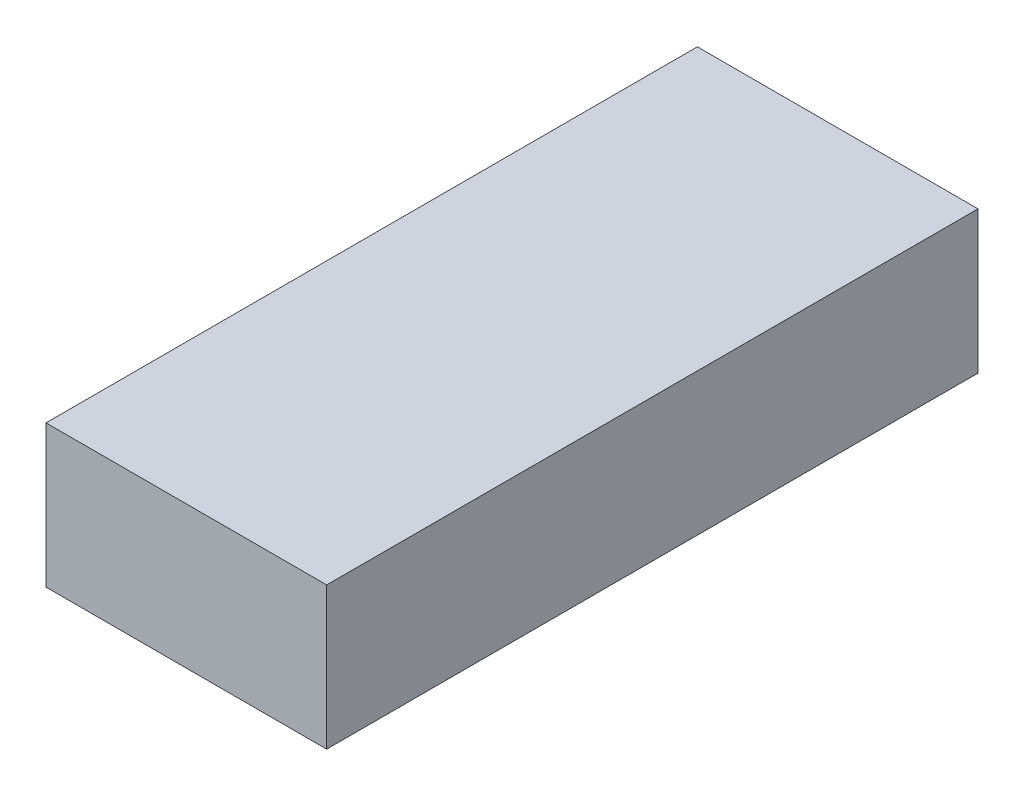
ISO-10303-21;
HEADER;
FILE_DESCRIPTION(('STEP AP214'),'2;1');
FILE_NAME('part.step','',(''),(''),'','','');
FILE_SCHEMA(('AUTOMOTIVE_DESIGN { 1 0 10303 214 1 1 1 1 }'));
ENDSEC;
DATA;
#1=APPLICATION_CONTEXT('core data for automotive mechanical design processes');
#2=APPLICATION_PROTOCOL_DEFINITION('international standard','automotive_design',2000,#1);
#3=PRODUCT_CONTEXT('',#1,'mechanical');
#4=PRODUCT('Part','Part','',(#3));
#5=PRODUCT_RELATED_PRODUCT_CATEGORY('part','',(#4));
#6=PRODUCT_DEFINITION_FORMATION('','',#4);
#7=PRODUCT_DEFINITION_CONTEXT('part definition',#1,'design');
#8=PRODUCT_DEFINITION('design','',#6,#7);
#9=PRODUCT_DEFINITION_SHAPE('','',#8);
#10=(LENGTH_UNIT() NAMED_UNIT(*) SI_UNIT(.MILLI.,.METRE.));
#11=(NAMED_UNIT(*) PLANE_ANGLE_UNIT() SI_UNIT($,.RADIAN.));
#12=(NAMED_UNIT(*) SI_UNIT($,.STERADIAN.) SOLID_ANGLE_UNIT());
#13=UNCERTAINTY_MEASURE_WITH_UNIT(LENGTH_MEASURE(1.E-05),#10,'distance_accuracy_value','');
#14=(GEOMETRIC_REPRESENTATION_CONTEXT(3) GLOBAL_UNCERTAINTY_ASSIGNED_CONTEXT((#13)) GLOBAL_UNIT_ASSIGNED_CONTEXT((#10,
#11,#12)) REPRESENTATION_CONTEXT('',''));
#15=CARTESIAN_POINT('',(0.,0.,0.));
#16=DIRECTION('',(0.,0.,1.));
#17=DIRECTION('',(1.,0.,0.));
#18=AXIS2_PLACEMENT_3D('',#15,#16,#17);
#19=CARTESIAN_POINT('',(-61.4499399668848,31.1676928938666,300.));
#20=DIRECTION('',(1.,0.,0.));
#21=DIRECTION('',(0.,0.,-1.));
#22=AXIS2_PLACEMENT_3D('',#19,#20,#21);
#23=PLANE('',#22);
#24=DIRECTION('',(0.,-1.,0.));
#25=VECTOR('',#24,1.);
#26=CARTESIAN_POINT('',(-61.4499399668848,31.1676928938666,0.));
#27=LINE('',#26,#25);
#28=CARTESIAN_POINT('',(-61.4499399668848,31.1676928938666,0.));
#29=VERTEX_POINT('',#28);
#30=CARTESIAN_POINT('',(-61.4499399668848,-34.3552978489212,0.));
#31=VERTEX_POINT('',#30);
#32=EDGE_CURVE('E100',#29,#31,#27,.T.);
#33=ORIENTED_EDGE('',*,*,#32,.T.);
#34=DIRECTION('',(0.,0.,-1.));
#35=VECTOR('',#34,1.);
#36=CARTESIAN_POINT('',(-61.4499399668848,-34.3552978489212,300.));
#37=LINE('',#36,#35);
#38=CARTESIAN_POINT('',(-61.4499399668848,-34.3552978489212,300.));
#39=VERTEX_POINT('',#38);
#40=EDGE_CURVE('E11',#39,#31,#37,.T.);
#41=ORIENTED_EDGE('',*,*,#40,.F.);
#42=DIRECTION('',(0.,-1.,0.));
#43=VECTOR('',#42,1.);
#44=CARTESIAN_POINT('',(-61.4499399668848,31.1676928938666,300.));
#45=LINE('',#44,#43);
#46=CARTESIAN_POINT('',(-61.4499399668848,31.1676928938666,300.));
#47=VERTEX_POINT('',#46);
#48=EDGE_CURVE('E88',#47,#39,#45,.T.);
#49=ORIENTED_EDGE('',*,*,#48,.F.);
#50=DIRECTION('',(0.,0.,-1.));
#51=VECTOR('',#50,1.);
#52=CARTESIAN_POINT('',(-61.4499399668848,31.1676928938666,300.));
#53=LINE('',#52,#51);
#54=EDGE_CURVE('E96',#47,#29,#53,.T.);
#55=ORIENTED_EDGE('',*,*,#54,.T.);
#56=EDGE_LOOP('',(#33,#41,#49,#55));
#57=FACE_BOUND('',#56,.T.);
#58=ADVANCED_FACE('F37',(#57),#23,.F.);
#59=CARTESIAN_POINT('',(-61.4499399668848,-34.3552978489212,300.));
#60=DIRECTION('',(0.,1.,0.));
#61=DIRECTION('',(0.,0.,1.));
#62=AXIS2_PLACEMENT_3D('',#59,#60,#61);
#63=PLANE('',#62);
#64=DIRECTION('',(1.,0.,0.));
#65=VECTOR('',#64,1.);
#66=CARTESIAN_POINT('',(-61.4499399668848,-34.3552978489212,0.));
#67=LINE('',#66,#65);
#68=CARTESIAN_POINT('',(67.8251498769938,-34.3552978489212,0.));
#69=VERTEX_POINT('',#68);
#70=EDGE_CURVE('E92',#31,#69,#67,.T.);
#71=ORIENTED_EDGE('',*,*,#70,.T.);
#72=DIRECTION('',(0.,0.,-1.));
#73=VECTOR('',#72,1.);
#74=CARTESIAN_POINT('',(67.8251498769938,-34.3552978489212,300.));
#75=LINE('',#74,#73);
#76=CARTESIAN_POINT('',(67.8251498769938,-34.3552978489212,300.));
#77=VERTEX_POINT('',#76);
#78=EDGE_CURVE('E45',#77,#69,#75,.T.);
#79=ORIENTED_EDGE('',*,*,#78,.F.);
#80=DIRECTION('',(1.,0.,0.));
#81=VECTOR('',#80,1.);
#82=CARTESIAN_POINT('',(-61.4499399668848,-34.3552978489212,300.));
#83=LINE('',#82,#81);
#84=EDGE_CURVE('E83',#39,#77,#83,.T.);
#85=ORIENTED_EDGE('',*,*,#84,.F.);
#86=ORIENTED_EDGE('',*,*,#40,.T.);
#87=EDGE_LOOP('',(#71,#79,#85,#86));
#88=FACE_BOUND('',#87,.T.);
#89=ADVANCED_FACE('F91',(#88),#63,.F.);
#90=CARTESIAN_POINT('',(67.8251498769938,31.1676928938666,300.));
#91=DIRECTION('',(-1.,0.,0.));
#92=DIRECTION('',(0.,0.,1.));
#93=AXIS2_PLACEMENT_3D('',#90,#91,#92);
#94=PLANE('',#93);
#95=DIRECTION('',(0.,1.,0.));
#96=VECTOR('',#95,1.);
#97=CARTESIAN_POINT('',(67.8251498769938,31.1676928938666,0.));
#98=LINE('',#97,#96);
#99=CARTESIAN_POINT('',(67.8251498769938,31.1676928938666,0.));
#100=VERTEX_POINT('',#99);
#101=EDGE_CURVE('E70',#69,#100,#98,.T.);
#102=ORIENTED_EDGE('',*,*,#101,.T.);
#103=DIRECTION('',(0.,0.,-1.));
#104=VECTOR('',#103,1.);
#105=CARTESIAN_POINT('',(67.8251498769938,31.1676928938666,300.));
#106=LINE('',#105,#104);
#107=CARTESIAN_POINT('',(67.8251498769938,31.1676928938666,300.));
#108=VERTEX_POINT('',#107);
#109=EDGE_CURVE('E93',#108,#100,#106,.T.);
#110=ORIENTED_EDGE('',*,*,#109,.F.);
#111=DIRECTION('',(0.,1.,0.));
#112=VECTOR('',#111,1.);
#113=CARTESIAN_POINT('',(67.8251498769938,31.1676928938666,300.));
#114=LINE('',#113,#112);
#115=EDGE_CURVE('E86',#77,#108,#114,.T.);
#116=ORIENTED_EDGE('',*,*,#115,.F.);
#117=ORIENTED_EDGE('',*,*,#78,.T.);
#118=EDGE_LOOP('',(#102,#110,#116,#117));
#119=FACE_BOUND('',#118,.T.);
#120=ADVANCED_FACE('F94',(#119),#94,.F.);
#121=CARTESIAN_POINT('',(-61.4499399668848,31.1676928938666,300.));
#122=DIRECTION('',(0.,-1.,0.));
#123=DIRECTION('',(0.,0.,-1.));
#124=AXIS2_PLACEMENT_3D('',#121,#122,#123);
#125=PLANE('',#124);
#126=DIRECTION('',(-1.,0.,0.));
#127=VECTOR('',#126,1.);
#128=CARTESIAN_POINT('',(-61.4499399668848,31.1676928938666,0.));
#129=LINE('',#128,#127);
#130=EDGE_CURVE('E76',#100,#29,#129,.T.);
#131=ORIENTED_EDGE('',*,*,#130,.T.);
#132=ORIENTED_EDGE('',*,*,#54,.F.);
#133=DIRECTION('',(-1.,0.,0.));
#134=VECTOR('',#133,1.);
#135=CARTESIAN_POINT('',(-61.4499399668848,31.1676928938666,300.));
#136=LINE('',#135,#134);
#137=EDGE_CURVE('E53',#108,#47,#136,.T.);
#138=ORIENTED_EDGE('',*,*,#137,.F.);
#139=ORIENTED_EDGE('',*,*,#109,.T.);
#140=EDGE_LOOP('',(#131,#132,#138,#139));
#141=FACE_BOUND('',#140,.T.);
#142=ADVANCED_FACE('F107',(#141),#125,.F.);
#143=CARTESIAN_POINT('',(0.,0.,300.));
#144=DIRECTION('',(0.,0.,1.));
#145=DIRECTION('',(1.,0.,0.));
#146=AXIS2_PLACEMENT_3D('',#143,#144,#145);
#147=PLANE('',#146);
#148=ORIENTED_EDGE('',*,*,#48,.T.);
#149=ORIENTED_EDGE('',*,*,#84,.T.);
#150=ORIENTED_EDGE('',*,*,#115,.T.);
#151=ORIENTED_EDGE('',*,*,#137,.T.);
#152=EDGE_LOOP('',(#148,#149,#150,#151));
#153=FACE_BOUND('',#152,.T.);
#154=ADVANCED_FACE('F84',(#153),#147,.T.);
#155=CARTESIAN_POINT('',(0.,0.,0.));
#156=DIRECTION('',(0.,0.,1.));
#157=DIRECTION('',(1.,0.,0.));
#158=AXIS2_PLACEMENT_3D('',#155,#156,#157);
#159=PLANE('',#158);
#160=ORIENTED_EDGE('',*,*,#32,.F.);
#161=ORIENTED_EDGE('',*,*,#130,.F.);
#162=ORIENTED_EDGE('',*,*,#101,.F.);
#163=ORIENTED_EDGE('',*,*,#70,.F.);
#164=EDGE_LOOP('',(#160,#161,#162,#163));
#165=FACE_BOUND('',#164,.T.);
#166=ADVANCED_FACE('F110',(#165),#159,.F.);
#167=CLOSED_SHELL('',(#58,#89,#120,#142,#154,#166));
#168=MANIFOLD_SOLID_BREP('B2',#167);
#169=ADVANCED_BREP_SHAPE_REPRESENTATION('',(#18,#168),#14);
#170=SHAPE_DEFINITION_REPRESENTATION(#9,#169);
ENDSEC;
END-ISO-10303-21;
